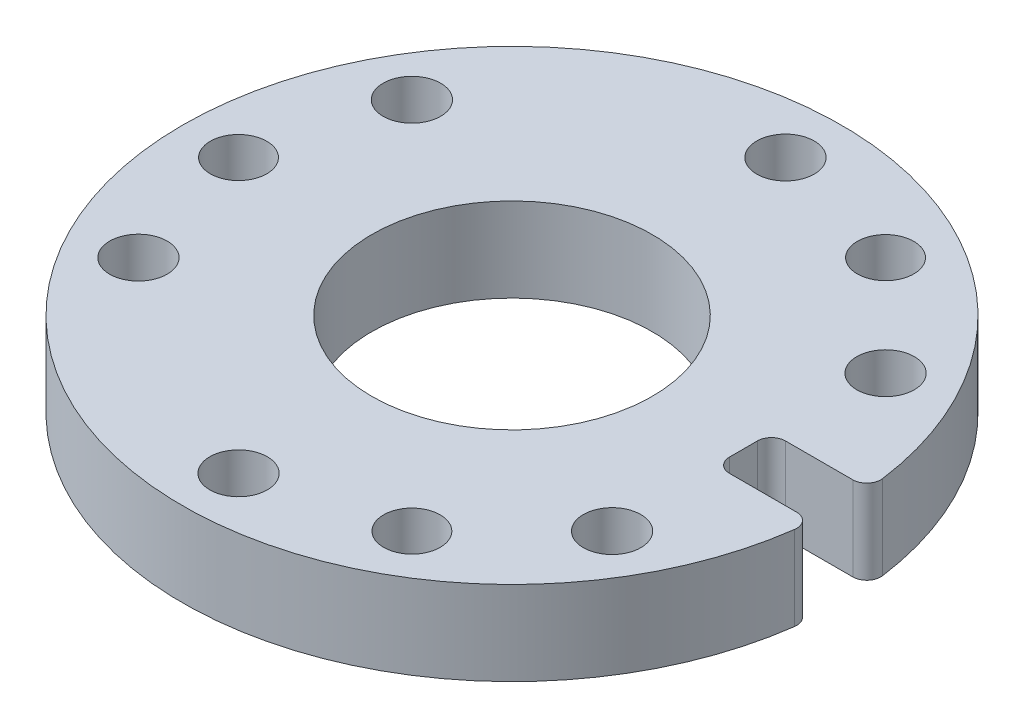
ISO-10303-21;
HEADER;
FILE_DESCRIPTION(('STEP AP214'),'2;1');
FILE_NAME('part.step','',(''),(''),'','','');
FILE_SCHEMA(('AUTOMOTIVE_DESIGN { 1 0 10303 214 1 1 1 1 }'));
ENDSEC;
DATA;
#1=APPLICATION_CONTEXT('core data for automotive mechanical design processes');
#2=APPLICATION_PROTOCOL_DEFINITION('international standard','automotive_design',2000,#1);
#3=PRODUCT_CONTEXT('',#1,'mechanical');
#4=PRODUCT('Part','Part','',(#3));
#5=PRODUCT_RELATED_PRODUCT_CATEGORY('part','',(#4));
#6=PRODUCT_DEFINITION_FORMATION('','',#4);
#7=PRODUCT_DEFINITION_CONTEXT('part definition',#1,'design');
#8=PRODUCT_DEFINITION('design','',#6,#7);
#9=PRODUCT_DEFINITION_SHAPE('','',#8);
#10=(LENGTH_UNIT() NAMED_UNIT(*) SI_UNIT(.MILLI.,.METRE.));
#11=(NAMED_UNIT(*) PLANE_ANGLE_UNIT() SI_UNIT($,.RADIAN.));
#12=(NAMED_UNIT(*) SI_UNIT($,.STERADIAN.) SOLID_ANGLE_UNIT());
#13=UNCERTAINTY_MEASURE_WITH_UNIT(LENGTH_MEASURE(1.E-05),#10,'distance_accuracy_value','');
#14=(GEOMETRIC_REPRESENTATION_CONTEXT(3) GLOBAL_UNCERTAINTY_ASSIGNED_CONTEXT((#13)) GLOBAL_UNIT_ASSIGNED_CONTEXT((#10,
#11,#12)) REPRESENTATION_CONTEXT('',''));
#15=CARTESIAN_POINT('',(0.,0.,0.));
#16=DIRECTION('',(0.,0.,1.));
#17=DIRECTION('',(1.,0.,0.));
#18=AXIS2_PLACEMENT_3D('',#15,#16,#17);
#19=CARTESIAN_POINT('',(0.,6.,0.));
#20=DIRECTION('',(0.,1.,0.));
#21=DIRECTION('',(0.,0.,1.));
#22=AXIS2_PLACEMENT_3D('',#19,#20,#21);
#23=PLANE('',#22);
#24=CARTESIAN_POINT('',(0.,6.,0.));
#25=DIRECTION('',(0.,1.,0.));
#26=DIRECTION('',(0.,0.,1.));
#27=AXIS2_PLACEMENT_3D('',#24,#25,#26);
#28=CIRCLE('',#27,23.5);
#29=CARTESIAN_POINT('',(23.290174370799,6.,-3.13333333333333));
#30=VERTEX_POINT('',#29);
#31=CARTESIAN_POINT('',(23.290174370799,6.,3.13333333333333));
#32=VERTEX_POINT('',#31);
#33=EDGE_CURVE('E115',#30,#32,#28,.T.);
#34=ORIENTED_EDGE('',*,*,#33,.T.);
#35=CARTESIAN_POINT('',(22.2991031209778,6.,3.));
#36=DIRECTION('',(0.,1.,0.));
#37=DIRECTION('',(0.,0.,1.));
#38=AXIS2_PLACEMENT_3D('',#35,#36,#37);
#39=CIRCLE('',#38,1.);
#40=CARTESIAN_POINT('',(22.2991031209778,6.,2.));
#41=VERTEX_POINT('',#40);
#42=EDGE_CURVE('E122',#32,#41,#39,.T.);
#43=ORIENTED_EDGE('',*,*,#42,.T.);
#44=DIRECTION('',(1.,0.,0.));
#45=VECTOR('',#44,1.);
#46=CARTESIAN_POINT('',(16.5,6.,2.));
#47=LINE('',#46,#45);
#48=CARTESIAN_POINT('',(17.5,6.,2.));
#49=VERTEX_POINT('',#48);
#50=EDGE_CURVE('E191',#49,#41,#47,.T.);
#51=ORIENTED_EDGE('',*,*,#50,.F.);
#52=CARTESIAN_POINT('',(17.5,6.,1.));
#53=DIRECTION('',(0.,1.,0.));
#54=DIRECTION('',(0.,0.,1.));
#55=AXIS2_PLACEMENT_3D('',#52,#53,#54);
#56=CIRCLE('',#55,1.);
#57=CARTESIAN_POINT('',(16.5,6.,1.));
#58=VERTEX_POINT('',#57);
#59=EDGE_CURVE('E175',#49,#58,#56,.F.);
#60=ORIENTED_EDGE('',*,*,#59,.T.);
#61=DIRECTION('',(0.,0.,1.));
#62=VECTOR('',#61,1.);
#63=CARTESIAN_POINT('',(16.5,6.,-2.));
#64=LINE('',#63,#62);
#65=CARTESIAN_POINT('',(16.5,6.,-1.));
#66=VERTEX_POINT('',#65);
#67=EDGE_CURVE('E183',#66,#58,#64,.T.);
#68=ORIENTED_EDGE('',*,*,#67,.F.);
#69=CARTESIAN_POINT('',(17.5,6.,-1.));
#70=DIRECTION('',(0.,1.,0.));
#71=DIRECTION('',(0.,0.,1.));
#72=AXIS2_PLACEMENT_3D('',#69,#70,#71);
#73=CIRCLE('',#72,1.);
#74=CARTESIAN_POINT('',(17.5,6.,-2.));
#75=VERTEX_POINT('',#74);
#76=EDGE_CURVE('E54',#66,#75,#73,.F.);
#77=ORIENTED_EDGE('',*,*,#76,.T.);
#78=DIRECTION('',(-1.,0.,0.));
#79=VECTOR('',#78,1.);
#80=CARTESIAN_POINT('',(16.5,6.,-2.));
#81=LINE('',#80,#79);
#82=CARTESIAN_POINT('',(22.2991031209778,6.,-2.));
#83=VERTEX_POINT('',#82);
#84=EDGE_CURVE('E117',#83,#75,#81,.T.);
#85=ORIENTED_EDGE('',*,*,#84,.F.);
#86=CARTESIAN_POINT('',(22.2991031209778,6.,-3.));
#87=DIRECTION('',(0.,1.,0.));
#88=DIRECTION('',(0.,0.,1.));
#89=AXIS2_PLACEMENT_3D('',#86,#87,#88);
#90=CIRCLE('',#89,1.);
#91=EDGE_CURVE('E112',#83,#30,#90,.T.);
#92=ORIENTED_EDGE('',*,*,#91,.T.);
#93=EDGE_LOOP('',(#34,#43,#51,#60,#68,#77,#85,#92));
#94=FACE_BOUND('',#93,.T.);
#95=CARTESIAN_POINT('',(9.75000000000008,6.,-16.8874953737965));
#96=DIRECTION('',(0.,1.,0.));
#97=DIRECTION('',(0.,0.,1.));
#98=AXIS2_PLACEMENT_3D('',#95,#96,#97);
#99=CIRCLE('',#98,2.015);
#100=CARTESIAN_POINT('',(9.75000000000008,6.,-14.8724953737965));
#101=VERTEX_POINT('',#100);
#102=EDGE_CURVE('E228',#101,#101,#99,.T.);
#103=ORIENTED_EDGE('',*,*,#102,.F.);
#104=EDGE_LOOP('',(#103));
#105=FACE_BOUND('',#104,.T.);
#106=CARTESIAN_POINT('',(-16.8874953737966,6.,9.74999999999984));
#107=DIRECTION('',(0.,1.,0.));
#108=DIRECTION('',(0.,0.,1.));
#109=AXIS2_PLACEMENT_3D('',#106,#107,#108);
#110=CIRCLE('',#109,2.05);
#111=CARTESIAN_POINT('',(-16.8874953737966,6.,11.7999999999998));
#112=VERTEX_POINT('',#111);
#113=EDGE_CURVE('E242',#112,#112,#110,.T.);
#114=ORIENTED_EDGE('',*,*,#113,.F.);
#115=EDGE_LOOP('',(#114));
#116=FACE_BOUND('',#115,.T.);
#117=CARTESIAN_POINT('',(16.8874953737965,6.,9.75000000000008));
#118=DIRECTION('',(0.,1.,0.));
#119=DIRECTION('',(0.,0.,1.));
#120=AXIS2_PLACEMENT_3D('',#117,#118,#119);
#121=CIRCLE('',#120,2.05);
#122=CARTESIAN_POINT('',(16.8874953737965,6.,11.8000000000001));
#123=VERTEX_POINT('',#122);
#124=EDGE_CURVE('E257',#123,#123,#121,.T.);
#125=ORIENTED_EDGE('',*,*,#124,.F.);
#126=EDGE_LOOP('',(#125));
#127=FACE_BOUND('',#126,.T.);
#128=CARTESIAN_POINT('',(-19.5,6.,0.));
#129=DIRECTION('',(0.,1.,0.));
#130=DIRECTION('',(0.,0.,1.));
#131=AXIS2_PLACEMENT_3D('',#128,#129,#130);
#132=CIRCLE('',#131,2.015);
#133=CARTESIAN_POINT('',(-19.5,6.,2.015));
#134=VERTEX_POINT('',#133);
#135=EDGE_CURVE('E273',#134,#134,#132,.T.);
#136=ORIENTED_EDGE('',*,*,#135,.F.);
#137=EDGE_LOOP('',(#136));
#138=FACE_BOUND('',#137,.T.);
#139=CARTESIAN_POINT('',(0.,6.,0.));
#140=DIRECTION('',(0.,1.,0.));
#141=DIRECTION('',(0.,0.,1.));
#142=AXIS2_PLACEMENT_3D('',#139,#140,#141);
#143=CIRCLE('',#142,10.);
#144=CARTESIAN_POINT('',(0.,6.,10.));
#145=VERTEX_POINT('',#144);
#146=EDGE_CURVE('E289',#145,#145,#143,.T.);
#147=ORIENTED_EDGE('',*,*,#146,.F.);
#148=EDGE_LOOP('',(#147));
#149=FACE_BOUND('',#148,.T.);
#150=CARTESIAN_POINT('',(0.,6.,-19.5));
#151=DIRECTION('',(0.,1.,0.));
#152=DIRECTION('',(0.,0.,1.));
#153=AXIS2_PLACEMENT_3D('',#150,#151,#152);
#154=CIRCLE('',#153,2.05);
#155=CARTESIAN_POINT('',(0.,6.,-17.45));
#156=VERTEX_POINT('',#155);
#157=EDGE_CURVE('E281',#156,#156,#154,.T.);
#158=ORIENTED_EDGE('',*,*,#157,.F.);
#159=EDGE_LOOP('',(#158));
#160=FACE_BOUND('',#159,.T.);
#161=CARTESIAN_POINT('',(16.8874953737966,6.,-9.74999999999996));
#162=DIRECTION('',(0.,1.,0.));
#163=DIRECTION('',(0.,0.,1.));
#164=AXIS2_PLACEMENT_3D('',#161,#162,#163);
#165=CIRCLE('',#164,2.05);
#166=CARTESIAN_POINT('',(16.8874953737966,6.,-7.69999999999996));
#167=VERTEX_POINT('',#166);
#168=EDGE_CURVE('E265',#167,#167,#165,.T.);
#169=ORIENTED_EDGE('',*,*,#168,.F.);
#170=EDGE_LOOP('',(#169));
#171=FACE_BOUND('',#170,.T.);
#172=CARTESIAN_POINT('',(-1.36167772214882E-13,6.,19.5));
#173=DIRECTION('',(0.,1.,0.));
#174=DIRECTION('',(0.,0.,1.));
#175=AXIS2_PLACEMENT_3D('',#172,#173,#174);
#176=CIRCLE('',#175,2.05);
#177=CARTESIAN_POINT('',(-1.36167772214882E-13,6.,21.55));
#178=VERTEX_POINT('',#177);
#179=EDGE_CURVE('E250',#178,#178,#176,.T.);
#180=ORIENTED_EDGE('',*,*,#179,.F.);
#181=EDGE_LOOP('',(#180));
#182=FACE_BOUND('',#181,.T.);
#183=CARTESIAN_POINT('',(-16.8874953737964,6.,-9.7500000000002));
#184=DIRECTION('',(0.,1.,0.));
#185=DIRECTION('',(0.,0.,1.));
#186=AXIS2_PLACEMENT_3D('',#183,#184,#185);
#187=CIRCLE('',#186,2.05);
#188=CARTESIAN_POINT('',(-16.8874953737964,6.,-7.7000000000002));
#189=VERTEX_POINT('',#188);
#190=EDGE_CURVE('E235',#189,#189,#187,.T.);
#191=ORIENTED_EDGE('',*,*,#190,.F.);
#192=EDGE_LOOP('',(#191));
#193=FACE_BOUND('',#192,.T.);
#194=CARTESIAN_POINT('',(9.74999999999984,6.,16.8874953737966));
#195=DIRECTION('',(0.,1.,0.));
#196=DIRECTION('',(0.,0.,1.));
#197=AXIS2_PLACEMENT_3D('',#194,#195,#196);
#198=CIRCLE('',#197,2.015);
#199=CARTESIAN_POINT('',(9.74999999999984,6.,18.9024953737966));
#200=VERTEX_POINT('',#199);
#201=EDGE_CURVE('E220',#200,#200,#198,.T.);
#202=ORIENTED_EDGE('',*,*,#201,.F.);
#203=EDGE_LOOP('',(#202));
#204=FACE_BOUND('',#203,.T.);
#205=ADVANCED_FACE('F45',(#94,#105,#116,#127,#138,#149,#160,#171,#182,#193,#204),#23,.T.);
#206=CARTESIAN_POINT('',(0.,0.,0.));
#207=DIRECTION('',(0.,1.,0.));
#208=DIRECTION('',(0.,0.,1.));
#209=AXIS2_PLACEMENT_3D('',#206,#207,#208);
#210=PLANE('',#209);
#211=DIRECTION('',(1.,0.,0.));
#212=VECTOR('',#211,1.);
#213=CARTESIAN_POINT('',(0.,0.,2.));
#214=LINE('',#213,#212);
#215=CARTESIAN_POINT('',(17.5,0.,2.));
#216=VERTEX_POINT('',#215);
#217=CARTESIAN_POINT('',(22.2991031209778,0.,2.));
#218=VERTEX_POINT('',#217);
#219=EDGE_CURVE('E190',#216,#218,#214,.T.);
#220=ORIENTED_EDGE('',*,*,#219,.T.);
#221=CARTESIAN_POINT('',(22.2991031209778,0.,3.));
#222=DIRECTION('',(0.,1.,0.));
#223=DIRECTION('',(0.,0.,1.));
#224=AXIS2_PLACEMENT_3D('',#221,#222,#223);
#225=CIRCLE('',#224,1.);
#226=CARTESIAN_POINT('',(23.290174370799,0.,3.13333333333333));
#227=VERTEX_POINT('',#226);
#228=EDGE_CURVE('E160',#218,#227,#225,.F.);
#229=ORIENTED_EDGE('',*,*,#228,.T.);
#230=CARTESIAN_POINT('',(0.,0.,0.));
#231=DIRECTION('',(0.,1.,0.));
#232=DIRECTION('',(0.,0.,1.));
#233=AXIS2_PLACEMENT_3D('',#230,#231,#232);
#234=CIRCLE('',#233,23.5);
#235=CARTESIAN_POINT('',(23.290174370799,0.,-3.13333333333333));
#236=VERTEX_POINT('',#235);
#237=EDGE_CURVE('E135',#236,#227,#234,.T.);
#238=ORIENTED_EDGE('',*,*,#237,.F.);
#239=CARTESIAN_POINT('',(22.2991031209778,0.,-3.));
#240=DIRECTION('',(0.,1.,0.));
#241=DIRECTION('',(0.,0.,1.));
#242=AXIS2_PLACEMENT_3D('',#239,#240,#241);
#243=CIRCLE('',#242,1.);
#244=CARTESIAN_POINT('',(22.2991031209778,0.,-2.));
#245=VERTEX_POINT('',#244);
#246=EDGE_CURVE('E138',#236,#245,#243,.F.);
#247=ORIENTED_EDGE('',*,*,#246,.T.);
#248=DIRECTION('',(-1.,0.,0.));
#249=VECTOR('',#248,1.);
#250=CARTESIAN_POINT('',(0.,0.,-2.));
#251=LINE('',#250,#249);
#252=CARTESIAN_POINT('',(17.5,0.,-2.));
#253=VERTEX_POINT('',#252);
#254=EDGE_CURVE('E216',#245,#253,#251,.T.);
#255=ORIENTED_EDGE('',*,*,#254,.T.);
#256=CARTESIAN_POINT('',(17.5,0.,-1.));
#257=DIRECTION('',(0.,1.,0.));
#258=DIRECTION('',(0.,0.,1.));
#259=AXIS2_PLACEMENT_3D('',#256,#257,#258);
#260=CIRCLE('',#259,1.);
#261=CARTESIAN_POINT('',(16.5,0.,-1.));
#262=VERTEX_POINT('',#261);
#263=EDGE_CURVE('E11',#253,#262,#260,.T.);
#264=ORIENTED_EDGE('',*,*,#263,.T.);
#265=DIRECTION('',(0.,0.,1.));
#266=VECTOR('',#265,1.);
#267=CARTESIAN_POINT('',(16.5,0.,0.));
#268=LINE('',#267,#266);
#269=CARTESIAN_POINT('',(16.5,0.,1.));
#270=VERTEX_POINT('',#269);
#271=EDGE_CURVE('E134',#262,#270,#268,.T.);
#272=ORIENTED_EDGE('',*,*,#271,.T.);
#273=CARTESIAN_POINT('',(17.5,0.,1.));
#274=DIRECTION('',(0.,1.,0.));
#275=DIRECTION('',(0.,0.,1.));
#276=AXIS2_PLACEMENT_3D('',#273,#274,#275);
#277=CIRCLE('',#276,1.);
#278=EDGE_CURVE('E177',#270,#216,#277,.T.);
#279=ORIENTED_EDGE('',*,*,#278,.T.);
#280=EDGE_LOOP('',(#220,#229,#238,#247,#255,#264,#272,#279));
#281=FACE_BOUND('',#280,.T.);
#282=CARTESIAN_POINT('',(0.,0.,0.));
#283=DIRECTION('',(0.,1.,0.));
#284=DIRECTION('',(0.,0.,1.));
#285=AXIS2_PLACEMENT_3D('',#282,#283,#284);
#286=CIRCLE('',#285,10.);
#287=CARTESIAN_POINT('',(0.,0.,10.));
#288=VERTEX_POINT('',#287);
#289=EDGE_CURVE('E285',#288,#288,#286,.T.);
#290=ORIENTED_EDGE('',*,*,#289,.T.);
#291=EDGE_LOOP('',(#290));
#292=FACE_BOUND('',#291,.T.);
#293=CARTESIAN_POINT('',(0.,0.,-19.5));
#294=DIRECTION('',(0.,1.,0.));
#295=DIRECTION('',(0.,0.,1.));
#296=AXIS2_PLACEMENT_3D('',#293,#294,#295);
#297=CIRCLE('',#296,2.05);
#298=CARTESIAN_POINT('',(0.,0.,-17.45));
#299=VERTEX_POINT('',#298);
#300=EDGE_CURVE('E277',#299,#299,#297,.T.);
#301=ORIENTED_EDGE('',*,*,#300,.T.);
#302=EDGE_LOOP('',(#301));
#303=FACE_BOUND('',#302,.T.);
#304=CARTESIAN_POINT('',(-19.5,0.,0.));
#305=DIRECTION('',(0.,1.,0.));
#306=DIRECTION('',(0.,0.,1.));
#307=AXIS2_PLACEMENT_3D('',#304,#305,#306);
#308=CIRCLE('',#307,2.015);
#309=CARTESIAN_POINT('',(-19.5,0.,2.015));
#310=VERTEX_POINT('',#309);
#311=EDGE_CURVE('E269',#310,#310,#308,.T.);
#312=ORIENTED_EDGE('',*,*,#311,.T.);
#313=EDGE_LOOP('',(#312));
#314=FACE_BOUND('',#313,.T.);
#315=CARTESIAN_POINT('',(16.8874953737966,0.,-9.74999999999996));
#316=DIRECTION('',(0.,1.,0.));
#317=DIRECTION('',(0.,0.,1.));
#318=AXIS2_PLACEMENT_3D('',#315,#316,#317);
#319=CIRCLE('',#318,2.05);
#320=CARTESIAN_POINT('',(16.8874953737966,0.,-7.69999999999996));
#321=VERTEX_POINT('',#320);
#322=EDGE_CURVE('E261',#321,#321,#319,.T.);
#323=ORIENTED_EDGE('',*,*,#322,.T.);
#324=EDGE_LOOP('',(#323));
#325=FACE_BOUND('',#324,.T.);
#326=CARTESIAN_POINT('',(16.8874953737965,0.,9.75000000000008));
#327=DIRECTION('',(0.,1.,0.));
#328=DIRECTION('',(0.,0.,1.));
#329=AXIS2_PLACEMENT_3D('',#326,#327,#328);
#330=CIRCLE('',#329,2.05);
#331=CARTESIAN_POINT('',(16.8874953737965,0.,11.8000000000001));
#332=VERTEX_POINT('',#331);
#333=EDGE_CURVE('E254',#332,#332,#330,.T.);
#334=ORIENTED_EDGE('',*,*,#333,.T.);
#335=EDGE_LOOP('',(#334));
#336=FACE_BOUND('',#335,.T.);
#337=CARTESIAN_POINT('',(-1.36167772214882E-13,0.,19.5));
#338=DIRECTION('',(0.,1.,0.));
#339=DIRECTION('',(0.,0.,1.));
#340=AXIS2_PLACEMENT_3D('',#337,#338,#339);
#341=CIRCLE('',#340,2.05);
#342=CARTESIAN_POINT('',(-1.36167772214882E-13,0.,21.55));
#343=VERTEX_POINT('',#342);
#344=EDGE_CURVE('E246',#343,#343,#341,.T.);
#345=ORIENTED_EDGE('',*,*,#344,.T.);
#346=EDGE_LOOP('',(#345));
#347=FACE_BOUND('',#346,.T.);
#348=CARTESIAN_POINT('',(-16.8874953737966,0.,9.74999999999984));
#349=DIRECTION('',(0.,1.,0.));
#350=DIRECTION('',(0.,0.,1.));
#351=AXIS2_PLACEMENT_3D('',#348,#349,#350);
#352=CIRCLE('',#351,2.05);
#353=CARTESIAN_POINT('',(-16.8874953737966,0.,11.7999999999998));
#354=VERTEX_POINT('',#353);
#355=EDGE_CURVE('E239',#354,#354,#352,.T.);
#356=ORIENTED_EDGE('',*,*,#355,.T.);
#357=EDGE_LOOP('',(#356));
#358=FACE_BOUND('',#357,.T.);
#359=CARTESIAN_POINT('',(-16.8874953737964,0.,-9.7500000000002));
#360=DIRECTION('',(0.,1.,0.));
#361=DIRECTION('',(0.,0.,1.));
#362=AXIS2_PLACEMENT_3D('',#359,#360,#361);
#363=CIRCLE('',#362,2.05);
#364=CARTESIAN_POINT('',(-16.8874953737964,0.,-7.7000000000002));
#365=VERTEX_POINT('',#364);
#366=EDGE_CURVE('E232',#365,#365,#363,.T.);
#367=ORIENTED_EDGE('',*,*,#366,.T.);
#368=EDGE_LOOP('',(#367));
#369=FACE_BOUND('',#368,.T.);
#370=CARTESIAN_POINT('',(9.75000000000008,0.,-16.8874953737965));
#371=DIRECTION('',(0.,1.,0.));
#372=DIRECTION('',(0.,0.,1.));
#373=AXIS2_PLACEMENT_3D('',#370,#371,#372);
#374=CIRCLE('',#373,2.015);
#375=CARTESIAN_POINT('',(9.75000000000008,0.,-14.8724953737965));
#376=VERTEX_POINT('',#375);
#377=EDGE_CURVE('E224',#376,#376,#374,.T.);
#378=ORIENTED_EDGE('',*,*,#377,.T.);
#379=EDGE_LOOP('',(#378));
#380=FACE_BOUND('',#379,.T.);
#381=CARTESIAN_POINT('',(9.74999999999984,0.,16.8874953737966));
#382=DIRECTION('',(0.,1.,0.));
#383=DIRECTION('',(0.,0.,1.));
#384=AXIS2_PLACEMENT_3D('',#381,#382,#383);
#385=CIRCLE('',#384,2.015);
#386=CARTESIAN_POINT('',(9.74999999999984,0.,18.9024953737966));
#387=VERTEX_POINT('',#386);
#388=EDGE_CURVE('E219',#387,#387,#385,.T.);
#389=ORIENTED_EDGE('',*,*,#388,.T.);
#390=EDGE_LOOP('',(#389));
#391=FACE_BOUND('',#390,.T.);
#392=ADVANCED_FACE('F196',(#281,#292,#303,#314,#325,#336,#347,#358,#369,#380,#391),#210,.F.);
#393=CARTESIAN_POINT('',(0.,6.,0.));
#394=DIRECTION('',(0.,-1.,0.));
#395=DIRECTION('',(0.,0.,-1.));
#396=AXIS2_PLACEMENT_3D('',#393,#394,#395);
#397=CYLINDRICAL_SURFACE('',#396,23.5);
#398=ORIENTED_EDGE('',*,*,#237,.T.);
#399=DIRECTION('',(0.,-1.,0.));
#400=VECTOR('',#399,1.);
#401=CARTESIAN_POINT('',(23.290174370799,6.,3.13333333333333));
#402=LINE('',#401,#400);
#403=EDGE_CURVE('E123',#227,#32,#402,.F.);
#404=ORIENTED_EDGE('',*,*,#403,.T.);
#405=ORIENTED_EDGE('',*,*,#33,.F.);
#406=DIRECTION('',(0.,-1.,0.));
#407=VECTOR('',#406,1.);
#408=CARTESIAN_POINT('',(23.290174370799,6.,-3.13333333333333));
#409=LINE('',#408,#407);
#410=EDGE_CURVE('E130',#30,#236,#409,.T.);
#411=ORIENTED_EDGE('',*,*,#410,.T.);
#412=EDGE_LOOP('',(#398,#404,#405,#411));
#413=FACE_BOUND('',#412,.T.);
#414=ADVANCED_FACE('F129',(#413),#397,.T.);
#415=CARTESIAN_POINT('',(0.,6.,0.));
#416=DIRECTION('',(0.,-1.,0.));
#417=DIRECTION('',(0.,0.,-1.));
#418=AXIS2_PLACEMENT_3D('',#415,#416,#417);
#419=CYLINDRICAL_SURFACE('',#418,10.);
#420=ORIENTED_EDGE('',*,*,#146,.T.);
#421=EDGE_LOOP('',(#420));
#422=FACE_BOUND('',#421,.T.);
#423=ORIENTED_EDGE('',*,*,#289,.F.);
#424=EDGE_LOOP('',(#423));
#425=FACE_BOUND('',#424,.T.);
#426=ADVANCED_FACE('F312',(#422,#425),#419,.F.);
#427=CARTESIAN_POINT('',(0.,6.,-19.5));
#428=DIRECTION('',(0.,-1.,0.));
#429=DIRECTION('',(0.,0.,-1.));
#430=AXIS2_PLACEMENT_3D('',#427,#428,#429);
#431=CYLINDRICAL_SURFACE('',#430,2.05);
#432=ORIENTED_EDGE('',*,*,#157,.T.);
#433=EDGE_LOOP('',(#432));
#434=FACE_BOUND('',#433,.T.);
#435=ORIENTED_EDGE('',*,*,#300,.F.);
#436=EDGE_LOOP('',(#435));
#437=FACE_BOUND('',#436,.T.);
#438=ADVANCED_FACE('F317',(#434,#437),#431,.F.);
#439=CARTESIAN_POINT('',(-19.5,6.,0.));
#440=DIRECTION('',(0.,-1.,0.));
#441=DIRECTION('',(0.,0.,-1.));
#442=AXIS2_PLACEMENT_3D('',#439,#440,#441);
#443=CYLINDRICAL_SURFACE('',#442,2.015);
#444=ORIENTED_EDGE('',*,*,#135,.T.);
#445=EDGE_LOOP('',(#444));
#446=FACE_BOUND('',#445,.T.);
#447=ORIENTED_EDGE('',*,*,#311,.F.);
#448=EDGE_LOOP('',(#447));
#449=FACE_BOUND('',#448,.T.);
#450=ADVANCED_FACE('F321',(#446,#449),#443,.F.);
#451=CARTESIAN_POINT('',(16.8874953737966,6.,-9.74999999999996));
#452=DIRECTION('',(0.,-1.,0.));
#453=DIRECTION('',(0.,0.,-1.));
#454=AXIS2_PLACEMENT_3D('',#451,#452,#453);
#455=CYLINDRICAL_SURFACE('',#454,2.05);
#456=ORIENTED_EDGE('',*,*,#168,.T.);
#457=EDGE_LOOP('',(#456));
#458=FACE_BOUND('',#457,.T.);
#459=ORIENTED_EDGE('',*,*,#322,.F.);
#460=EDGE_LOOP('',(#459));
#461=FACE_BOUND('',#460,.T.);
#462=ADVANCED_FACE('F372',(#458,#461),#455,.F.);
#463=CARTESIAN_POINT('',(16.8874953737965,6.,9.75000000000008));
#464=DIRECTION('',(0.,-1.,0.));
#465=DIRECTION('',(0.,0.,-1.));
#466=AXIS2_PLACEMENT_3D('',#463,#464,#465);
#467=CYLINDRICAL_SURFACE('',#466,2.05);
#468=ORIENTED_EDGE('',*,*,#124,.T.);
#469=EDGE_LOOP('',(#468));
#470=FACE_BOUND('',#469,.T.);
#471=ORIENTED_EDGE('',*,*,#333,.F.);
#472=EDGE_LOOP('',(#471));
#473=FACE_BOUND('',#472,.T.);
#474=ADVANCED_FACE('F368',(#470,#473),#467,.F.);
#475=CARTESIAN_POINT('',(-1.36167772214882E-13,6.,19.5));
#476=DIRECTION('',(0.,-1.,0.));
#477=DIRECTION('',(0.,0.,-1.));
#478=AXIS2_PLACEMENT_3D('',#475,#476,#477);
#479=CYLINDRICAL_SURFACE('',#478,2.05);
#480=ORIENTED_EDGE('',*,*,#179,.T.);
#481=EDGE_LOOP('',(#480));
#482=FACE_BOUND('',#481,.T.);
#483=ORIENTED_EDGE('',*,*,#344,.F.);
#484=EDGE_LOOP('',(#483));
#485=FACE_BOUND('',#484,.T.);
#486=ADVANCED_FACE('F364',(#482,#485),#479,.F.);
#487=CARTESIAN_POINT('',(-16.8874953737966,6.,9.74999999999984));
#488=DIRECTION('',(0.,-1.,0.));
#489=DIRECTION('',(0.,0.,-1.));
#490=AXIS2_PLACEMENT_3D('',#487,#488,#489);
#491=CYLINDRICAL_SURFACE('',#490,2.05);
#492=ORIENTED_EDGE('',*,*,#113,.T.);
#493=EDGE_LOOP('',(#492));
#494=FACE_BOUND('',#493,.T.);
#495=ORIENTED_EDGE('',*,*,#355,.F.);
#496=EDGE_LOOP('',(#495));
#497=FACE_BOUND('',#496,.T.);
#498=ADVANCED_FACE('F360',(#494,#497),#491,.F.);
#499=CARTESIAN_POINT('',(-16.8874953737964,6.,-9.7500000000002));
#500=DIRECTION('',(0.,-1.,0.));
#501=DIRECTION('',(0.,0.,-1.));
#502=AXIS2_PLACEMENT_3D('',#499,#500,#501);
#503=CYLINDRICAL_SURFACE('',#502,2.05);
#504=ORIENTED_EDGE('',*,*,#190,.T.);
#505=EDGE_LOOP('',(#504));
#506=FACE_BOUND('',#505,.T.);
#507=ORIENTED_EDGE('',*,*,#366,.F.);
#508=EDGE_LOOP('',(#507));
#509=FACE_BOUND('',#508,.T.);
#510=ADVANCED_FACE('F354',(#506,#509),#503,.F.);
#511=CARTESIAN_POINT('',(9.75000000000008,6.,-16.8874953737965));
#512=DIRECTION('',(0.,-1.,0.));
#513=DIRECTION('',(0.,0.,-1.));
#514=AXIS2_PLACEMENT_3D('',#511,#512,#513);
#515=CYLINDRICAL_SURFACE('',#514,2.015);
#516=ORIENTED_EDGE('',*,*,#102,.T.);
#517=EDGE_LOOP('',(#516));
#518=FACE_BOUND('',#517,.T.);
#519=ORIENTED_EDGE('',*,*,#377,.F.);
#520=EDGE_LOOP('',(#519));
#521=FACE_BOUND('',#520,.T.);
#522=ADVANCED_FACE('F347',(#518,#521),#515,.F.);
#523=CARTESIAN_POINT('',(9.74999999999984,6.,16.8874953737966));
#524=DIRECTION('',(0.,-1.,0.));
#525=DIRECTION('',(0.,0.,-1.));
#526=AXIS2_PLACEMENT_3D('',#523,#524,#525);
#527=CYLINDRICAL_SURFACE('',#526,2.015);
#528=ORIENTED_EDGE('',*,*,#201,.T.);
#529=EDGE_LOOP('',(#528));
#530=FACE_BOUND('',#529,.T.);
#531=ORIENTED_EDGE('',*,*,#388,.F.);
#532=EDGE_LOOP('',(#531));
#533=FACE_BOUND('',#532,.T.);
#534=ADVANCED_FACE('F345',(#530,#533),#527,.F.);
#535=CARTESIAN_POINT('',(16.5,-4.,-2.));
#536=DIRECTION('',(-1.,0.,0.));
#537=DIRECTION('',(0.,0.,1.));
#538=AXIS2_PLACEMENT_3D('',#535,#536,#537);
#539=PLANE('',#538);
#540=ORIENTED_EDGE('',*,*,#67,.T.);
#541=DIRECTION('',(0.,1.,0.));
#542=VECTOR('',#541,1.);
#543=CARTESIAN_POINT('',(16.5,0.,1.));
#544=LINE('',#543,#542);
#545=EDGE_CURVE('E61',#58,#270,#544,.F.);
#546=ORIENTED_EDGE('',*,*,#545,.T.);
#547=ORIENTED_EDGE('',*,*,#271,.F.);
#548=DIRECTION('',(0.,1.,0.));
#549=VECTOR('',#548,1.);
#550=CARTESIAN_POINT('',(16.5,6.,-1.));
#551=LINE('',#550,#549);
#552=EDGE_CURVE('E169',#262,#66,#551,.T.);
#553=ORIENTED_EDGE('',*,*,#552,.T.);
#554=EDGE_LOOP('',(#540,#546,#547,#553));
#555=FACE_BOUND('',#554,.T.);
#556=ADVANCED_FACE('F193',(#555),#539,.F.);
#557=CARTESIAN_POINT('',(16.5,-4.,-2.));
#558=DIRECTION('',(0.,0.,-1.));
#559=DIRECTION('',(-1.,0.,0.));
#560=AXIS2_PLACEMENT_3D('',#557,#558,#559);
#561=PLANE('',#560);
#562=ORIENTED_EDGE('',*,*,#254,.F.);
#563=DIRECTION('',(0.,-1.,0.));
#564=VECTOR('',#563,1.);
#565=CARTESIAN_POINT('',(22.2991031209778,-4.,-2.));
#566=LINE('',#565,#564);
#567=EDGE_CURVE('E166',#245,#83,#566,.F.);
#568=ORIENTED_EDGE('',*,*,#567,.T.);
#569=ORIENTED_EDGE('',*,*,#84,.T.);
#570=DIRECTION('',(0.,1.,0.));
#571=VECTOR('',#570,1.);
#572=CARTESIAN_POINT('',(17.5,0.,-2.));
#573=LINE('',#572,#571);
#574=EDGE_CURVE('E163',#75,#253,#573,.F.);
#575=ORIENTED_EDGE('',*,*,#574,.T.);
#576=EDGE_LOOP('',(#562,#568,#569,#575));
#577=FACE_BOUND('',#576,.T.);
#578=ADVANCED_FACE('F189',(#577),#561,.F.);
#579=CARTESIAN_POINT('',(16.5,-4.,2.));
#580=DIRECTION('',(0.,0.,1.));
#581=DIRECTION('',(1.,0.,0.));
#582=AXIS2_PLACEMENT_3D('',#579,#580,#581);
#583=PLANE('',#582);
#584=ORIENTED_EDGE('',*,*,#50,.T.);
#585=DIRECTION('',(0.,-1.,0.));
#586=VECTOR('',#585,1.);
#587=CARTESIAN_POINT('',(22.2991031209778,-4.,2.));
#588=LINE('',#587,#586);
#589=EDGE_CURVE('E155',#41,#218,#588,.T.);
#590=ORIENTED_EDGE('',*,*,#589,.T.);
#591=ORIENTED_EDGE('',*,*,#219,.F.);
#592=DIRECTION('',(0.,1.,0.));
#593=VECTOR('',#592,1.);
#594=CARTESIAN_POINT('',(17.5,6.,2.));
#595=LINE('',#594,#593);
#596=EDGE_CURVE('E151',#216,#49,#595,.T.);
#597=ORIENTED_EDGE('',*,*,#596,.T.);
#598=EDGE_LOOP('',(#584,#590,#591,#597));
#599=FACE_BOUND('',#598,.T.);
#600=ADVANCED_FACE('F205',(#599),#583,.F.);
#601=CARTESIAN_POINT('',(22.2991031209778,6.,3.));
#602=DIRECTION('',(0.,-1.,0.));
#603=DIRECTION('',(0.,0.,-1.));
#604=AXIS2_PLACEMENT_3D('',#601,#602,#603);
#605=CYLINDRICAL_SURFACE('',#604,1.);
#606=ORIENTED_EDGE('',*,*,#228,.F.);
#607=ORIENTED_EDGE('',*,*,#589,.F.);
#608=ORIENTED_EDGE('',*,*,#42,.F.);
#609=ORIENTED_EDGE('',*,*,#403,.F.);
#610=EDGE_LOOP('',(#606,#607,#608,#609));
#611=FACE_BOUND('',#610,.T.);
#612=ADVANCED_FACE('F297',(#611),#605,.T.);
#613=CARTESIAN_POINT('',(22.2991031209778,6.,-3.));
#614=DIRECTION('',(0.,-1.,0.));
#615=DIRECTION('',(0.,0.,-1.));
#616=AXIS2_PLACEMENT_3D('',#613,#614,#615);
#617=CYLINDRICAL_SURFACE('',#616,1.);
#618=ORIENTED_EDGE('',*,*,#91,.F.);
#619=ORIENTED_EDGE('',*,*,#567,.F.);
#620=ORIENTED_EDGE('',*,*,#246,.F.);
#621=ORIENTED_EDGE('',*,*,#410,.F.);
#622=EDGE_LOOP('',(#618,#619,#620,#621));
#623=FACE_BOUND('',#622,.T.);
#624=ADVANCED_FACE('F137',(#623),#617,.T.);
#625=CARTESIAN_POINT('',(17.5,-4.,1.));
#626=DIRECTION('',(0.,-1.,0.));
#627=DIRECTION('',(0.,0.,-1.));
#628=AXIS2_PLACEMENT_3D('',#625,#626,#627);
#629=CYLINDRICAL_SURFACE('',#628,1.);
#630=ORIENTED_EDGE('',*,*,#278,.F.);
#631=ORIENTED_EDGE('',*,*,#545,.F.);
#632=ORIENTED_EDGE('',*,*,#59,.F.);
#633=ORIENTED_EDGE('',*,*,#596,.F.);
#634=EDGE_LOOP('',(#630,#631,#632,#633));
#635=FACE_BOUND('',#634,.T.);
#636=ADVANCED_FACE('F201',(#635),#629,.F.);
#637=CARTESIAN_POINT('',(17.5,-4.,-1.));
#638=DIRECTION('',(0.,-1.,0.));
#639=DIRECTION('',(0.,0.,-1.));
#640=AXIS2_PLACEMENT_3D('',#637,#638,#639);
#641=CYLINDRICAL_SURFACE('',#640,1.);
#642=ORIENTED_EDGE('',*,*,#263,.F.);
#643=ORIENTED_EDGE('',*,*,#574,.F.);
#644=ORIENTED_EDGE('',*,*,#76,.F.);
#645=ORIENTED_EDGE('',*,*,#552,.F.);
#646=EDGE_LOOP('',(#642,#643,#644,#645));
#647=FACE_BOUND('',#646,.T.);
#648=ADVANCED_FACE('F47',(#647),#641,.F.);
#649=CLOSED_SHELL('',(#205,#392,#414,#426,#438,#450,#462,#474,#486,#498,#510,#522,#534,#556,
#578,#600,#612,#624,#636,#648));
#650=MANIFOLD_SOLID_BREP('B2',#649);
#651=ADVANCED_BREP_SHAPE_REPRESENTATION('',(#18,#650),#14);
#652=SHAPE_DEFINITION_REPRESENTATION(#9,#651);
ENDSEC;
END-ISO-10303-21;
